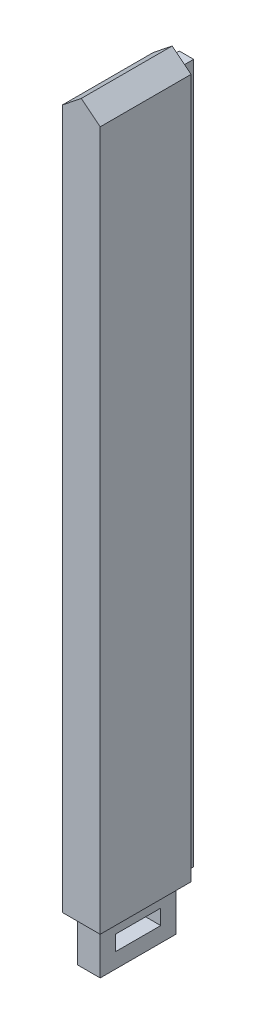
ISO-10303-21;
HEADER;
FILE_DESCRIPTION(('STEP AP214'),'2;1');
FILE_NAME('part.step','',(''),(''),'','','');
FILE_SCHEMA(('AUTOMOTIVE_DESIGN { 1 0 10303 214 1 1 1 1 }'));
ENDSEC;
DATA;
#1=APPLICATION_CONTEXT('core data for automotive mechanical design processes');
#2=APPLICATION_PROTOCOL_DEFINITION('international standard','automotive_design',2000,#1);
#3=PRODUCT_CONTEXT('',#1,'mechanical');
#4=PRODUCT('Part','Part','',(#3));
#5=PRODUCT_RELATED_PRODUCT_CATEGORY('part','',(#4));
#6=PRODUCT_DEFINITION_FORMATION('','',#4);
#7=PRODUCT_DEFINITION_CONTEXT('part definition',#1,'design');
#8=PRODUCT_DEFINITION('design','',#6,#7);
#9=PRODUCT_DEFINITION_SHAPE('','',#8);
#10=(LENGTH_UNIT() NAMED_UNIT(*) SI_UNIT(.MILLI.,.METRE.));
#11=(NAMED_UNIT(*) PLANE_ANGLE_UNIT() SI_UNIT($,.RADIAN.));
#12=(NAMED_UNIT(*) SI_UNIT($,.STERADIAN.) SOLID_ANGLE_UNIT());
#13=UNCERTAINTY_MEASURE_WITH_UNIT(LENGTH_MEASURE(1.E-05),#10,'distance_accuracy_value','');
#14=(GEOMETRIC_REPRESENTATION_CONTEXT(3) GLOBAL_UNCERTAINTY_ASSIGNED_CONTEXT((#13)) GLOBAL_UNIT_ASSIGNED_CONTEXT((#10,
#11,#12)) REPRESENTATION_CONTEXT('',''));
#15=CARTESIAN_POINT('',(0.,0.,0.));
#16=DIRECTION('',(0.,0.,1.));
#17=DIRECTION('',(1.,0.,0.));
#18=AXIS2_PLACEMENT_3D('',#15,#16,#17);
#19=CARTESIAN_POINT('',(1.,-98.4,0.));
#20=DIRECTION('',(1.,0.,0.));
#21=DIRECTION('',(0.,0.,-1.));
#22=AXIS2_PLACEMENT_3D('',#19,#20,#21);
#23=PLANE('',#22);
#24=DIRECTION('',(0.,0.,-1.));
#25=VECTOR('',#24,1.);
#26=CARTESIAN_POINT('',(1.,-92.4,0.));
#27=LINE('',#26,#25);
#28=CARTESIAN_POINT('',(1.,-92.4,11.));
#29=VERTEX_POINT('',#28);
#30=CARTESIAN_POINT('',(1.,-92.4,1.));
#31=VERTEX_POINT('',#30);
#32=EDGE_CURVE('E218',#29,#31,#27,.T.);
#33=ORIENTED_EDGE('',*,*,#32,.T.);
#34=DIRECTION('',(0.,1.,0.));
#35=VECTOR('',#34,1.);
#36=CARTESIAN_POINT('',(1.,-98.4,1.));
#37=LINE('',#36,#35);
#38=CARTESIAN_POINT('',(1.,-98.4,1.));
#39=VERTEX_POINT('',#38);
#40=EDGE_CURVE('E233',#39,#31,#37,.T.);
#41=ORIENTED_EDGE('',*,*,#40,.F.);
#42=DIRECTION('',(0.,0.,-1.));
#43=VECTOR('',#42,1.);
#44=CARTESIAN_POINT('',(1.,-98.4,0.));
#45=LINE('',#44,#43);
#46=CARTESIAN_POINT('',(1.,-98.4,11.));
#47=VERTEX_POINT('',#46);
#48=EDGE_CURVE('E203',#47,#39,#45,.T.);
#49=ORIENTED_EDGE('',*,*,#48,.F.);
#50=DIRECTION('',(0.,1.,0.));
#51=VECTOR('',#50,1.);
#52=CARTESIAN_POINT('',(1.,-98.4,11.));
#53=LINE('',#52,#51);
#54=EDGE_CURVE('E237',#47,#29,#53,.T.);
#55=ORIENTED_EDGE('',*,*,#54,.T.);
#56=EDGE_LOOP('',(#33,#41,#49,#55));
#57=FACE_BOUND('',#56,.T.);
#58=DIRECTION('',(0.,0.,-1.));
#59=VECTOR('',#58,1.);
#60=CARTESIAN_POINT('',(1.00000000000001,-96.4,0.));
#61=LINE('',#60,#59);
#62=CARTESIAN_POINT('',(1.,-96.4,9.));
#63=VERTEX_POINT('',#62);
#64=CARTESIAN_POINT('',(1.00000000000001,-96.4,3.));
#65=VERTEX_POINT('',#64);
#66=EDGE_CURVE('E61',#63,#65,#61,.T.);
#67=ORIENTED_EDGE('',*,*,#66,.T.);
#68=DIRECTION('',(0.,1.,0.));
#69=VECTOR('',#68,1.);
#70=CARTESIAN_POINT('',(1.00000000000001,0.,3.));
#71=LINE('',#70,#69);
#72=CARTESIAN_POINT('',(1.00000000000001,-94.4,3.));
#73=VERTEX_POINT('',#72);
#74=EDGE_CURVE('E174',#65,#73,#71,.T.);
#75=ORIENTED_EDGE('',*,*,#74,.T.);
#76=DIRECTION('',(0.,0.,-1.));
#77=VECTOR('',#76,1.);
#78=CARTESIAN_POINT('',(1.00000000000001,-94.4,0.));
#79=LINE('',#78,#77);
#80=CARTESIAN_POINT('',(1.00000000000001,-94.4,9.));
#81=VERTEX_POINT('',#80);
#82=EDGE_CURVE('E181',#81,#73,#79,.T.);
#83=ORIENTED_EDGE('',*,*,#82,.F.);
#84=DIRECTION('',(0.,1.,0.));
#85=VECTOR('',#84,1.);
#86=CARTESIAN_POINT('',(1.00000000000001,0.,9.));
#87=LINE('',#86,#85);
#88=EDGE_CURVE('E184',#63,#81,#87,.T.);
#89=ORIENTED_EDGE('',*,*,#88,.F.);
#90=EDGE_LOOP('',(#67,#75,#83,#89));
#91=FACE_BOUND('',#90,.T.);
#92=ADVANCED_FACE('F45',(#57,#91),#23,.F.);
#93=CARTESIAN_POINT('',(4.00000000000001,-98.4,0.));
#94=DIRECTION('',(1.,0.,0.));
#95=DIRECTION('',(0.,0.,-1.));
#96=AXIS2_PLACEMENT_3D('',#93,#94,#95);
#97=PLANE('',#96);
#98=DIRECTION('',(0.,0.,-1.));
#99=VECTOR('',#98,1.);
#100=CARTESIAN_POINT('',(4.00000000000001,-92.4,0.));
#101=LINE('',#100,#99);
#102=CARTESIAN_POINT('',(4.00000000000001,-92.4,11.));
#103=VERTEX_POINT('',#102);
#104=CARTESIAN_POINT('',(4.00000000000001,-92.4,0.999999999999999));
#105=VERTEX_POINT('',#104);
#106=EDGE_CURVE('E204',#103,#105,#101,.T.);
#107=ORIENTED_EDGE('',*,*,#106,.F.);
#108=DIRECTION('',(0.,1.,0.));
#109=VECTOR('',#108,1.);
#110=CARTESIAN_POINT('',(4.00000000000001,-98.4,11.));
#111=LINE('',#110,#109);
#112=CARTESIAN_POINT('',(4.00000000000001,-98.4,11.));
#113=VERTEX_POINT('',#112);
#114=EDGE_CURVE('E214',#113,#103,#111,.T.);
#115=ORIENTED_EDGE('',*,*,#114,.F.);
#116=DIRECTION('',(0.,0.,-1.));
#117=VECTOR('',#116,1.);
#118=CARTESIAN_POINT('',(4.00000000000001,-98.4,0.));
#119=LINE('',#118,#117);
#120=CARTESIAN_POINT('',(4.00000000000001,-98.4,1.));
#121=VERTEX_POINT('',#120);
#122=EDGE_CURVE('E210',#113,#121,#119,.T.);
#123=ORIENTED_EDGE('',*,*,#122,.T.);
#124=DIRECTION('',(0.,1.,0.));
#125=VECTOR('',#124,1.);
#126=CARTESIAN_POINT('',(4.00000000000001,-98.4,1.));
#127=LINE('',#126,#125);
#128=EDGE_CURVE('E229',#121,#105,#127,.T.);
#129=ORIENTED_EDGE('',*,*,#128,.T.);
#130=EDGE_LOOP('',(#107,#115,#123,#129));
#131=FACE_BOUND('',#130,.T.);
#132=DIRECTION('',(0.,-1.,0.));
#133=VECTOR('',#132,1.);
#134=CARTESIAN_POINT('',(4.00000000000001,-98.4,3.));
#135=LINE('',#134,#133);
#136=CARTESIAN_POINT('',(4.00000000000001,-94.4,3.));
#137=VERTEX_POINT('',#136);
#138=CARTESIAN_POINT('',(4.00000000000001,-96.4,3.));
#139=VERTEX_POINT('',#138);
#140=EDGE_CURVE('E54',#137,#139,#135,.T.);
#141=ORIENTED_EDGE('',*,*,#140,.T.);
#142=DIRECTION('',(0.,0.,1.));
#143=VECTOR('',#142,1.);
#144=CARTESIAN_POINT('',(4.00000000000001,-96.4,0.));
#145=LINE('',#144,#143);
#146=CARTESIAN_POINT('',(4.00000000000001,-96.4,9.));
#147=VERTEX_POINT('',#146);
#148=EDGE_CURVE('E11',#139,#147,#145,.T.);
#149=ORIENTED_EDGE('',*,*,#148,.T.);
#150=DIRECTION('',(0.,-1.,0.));
#151=VECTOR('',#150,1.);
#152=CARTESIAN_POINT('',(4.00000000000001,-98.4,9.));
#153=LINE('',#152,#151);
#154=CARTESIAN_POINT('',(4.00000000000001,-94.4,9.));
#155=VERTEX_POINT('',#154);
#156=EDGE_CURVE('E334',#155,#147,#153,.T.);
#157=ORIENTED_EDGE('',*,*,#156,.F.);
#158=DIRECTION('',(0.,0.,1.));
#159=VECTOR('',#158,1.);
#160=CARTESIAN_POINT('',(4.00000000000001,-94.4,0.));
#161=LINE('',#160,#159);
#162=EDGE_CURVE('E337',#137,#155,#161,.T.);
#163=ORIENTED_EDGE('',*,*,#162,.F.);
#164=EDGE_LOOP('',(#141,#149,#157,#163));
#165=FACE_BOUND('',#164,.T.);
#166=ADVANCED_FACE('F342',(#131,#165),#97,.T.);
#167=CARTESIAN_POINT('',(1.9482421875,2.43835258245095,12.));
#168=DIRECTION('',(-0.624218261107443,-0.78125,0.));
#169=DIRECTION('',(0.78125,-0.624218261107443,0.));
#170=AXIS2_PLACEMENT_3D('',#167,#168,#169);
#171=PLANE('',#170);
#172=DIRECTION('',(-0.78125,0.624218261107443,0.));
#173=VECTOR('',#172,1.);
#174=CARTESIAN_POINT('',(1.9482421875,2.43835258245095,0.));
#175=LINE('',#174,#173);
#176=CARTESIAN_POINT('',(5.,0.,0.));
#177=VERTEX_POINT('',#176);
#178=CARTESIAN_POINT('',(2.5,1.99749843554382,0.));
#179=VERTEX_POINT('',#178);
#180=EDGE_CURVE('E279',#177,#179,#175,.T.);
#181=ORIENTED_EDGE('',*,*,#180,.T.);
#182=DIRECTION('',(0.,0.,-1.));
#183=VECTOR('',#182,1.);
#184=CARTESIAN_POINT('',(2.5,1.99749843554382,12.));
#185=LINE('',#184,#183);
#186=CARTESIAN_POINT('',(2.5,1.99749843554382,12.));
#187=VERTEX_POINT('',#186);
#188=EDGE_CURVE('E330',#187,#179,#185,.T.);
#189=ORIENTED_EDGE('',*,*,#188,.F.);
#190=DIRECTION('',(-0.78125,0.624218261107443,0.));
#191=VECTOR('',#190,1.);
#192=CARTESIAN_POINT('',(1.9482421875,2.43835258245095,12.));
#193=LINE('',#192,#191);
#194=CARTESIAN_POINT('',(5.,0.,12.));
#195=VERTEX_POINT('',#194);
#196=EDGE_CURVE('E280',#195,#187,#193,.T.);
#197=ORIENTED_EDGE('',*,*,#196,.F.);
#198=DIRECTION('',(0.,0.,-1.));
#199=VECTOR('',#198,1.);
#200=CARTESIAN_POINT('',(5.,0.,12.));
#201=LINE('',#200,#199);
#202=EDGE_CURVE('E298',#195,#177,#201,.T.);
#203=ORIENTED_EDGE('',*,*,#202,.T.);
#204=EDGE_LOOP('',(#181,#189,#197,#203));
#205=FACE_BOUND('',#204,.T.);
#206=ADVANCED_FACE('F47',(#205),#171,.F.);
#207=CARTESIAN_POINT('',(0.,0.,12.));
#208=DIRECTION('',(0.624218261107443,-0.78125,0.));
#209=DIRECTION('',(0.78125,0.624218261107443,0.));
#210=AXIS2_PLACEMENT_3D('',#207,#208,#209);
#211=PLANE('',#210);
#212=DIRECTION('',(-0.78125,-0.624218261107443,0.));
#213=VECTOR('',#212,1.);
#214=CARTESIAN_POINT('',(0.,0.,0.));
#215=LINE('',#214,#213);
#216=CARTESIAN_POINT('',(0.,0.,0.));
#217=VERTEX_POINT('',#216);
#218=EDGE_CURVE('E302',#179,#217,#215,.T.);
#219=ORIENTED_EDGE('',*,*,#218,.T.);
#220=DIRECTION('',(0.,0.,-1.));
#221=VECTOR('',#220,1.);
#222=CARTESIAN_POINT('',(0.,0.,12.));
#223=LINE('',#222,#221);
#224=CARTESIAN_POINT('',(0.,0.,12.));
#225=VERTEX_POINT('',#224);
#226=EDGE_CURVE('E326',#225,#217,#223,.T.);
#227=ORIENTED_EDGE('',*,*,#226,.F.);
#228=DIRECTION('',(-0.78125,-0.624218261107443,0.));
#229=VECTOR('',#228,1.);
#230=CARTESIAN_POINT('',(0.,0.,12.));
#231=LINE('',#230,#229);
#232=EDGE_CURVE('E284',#187,#225,#231,.T.);
#233=ORIENTED_EDGE('',*,*,#232,.F.);
#234=ORIENTED_EDGE('',*,*,#188,.T.);
#235=EDGE_LOOP('',(#219,#227,#233,#234));
#236=FACE_BOUND('',#235,.T.);
#237=ADVANCED_FACE('F403',(#236),#211,.F.);
#238=CARTESIAN_POINT('',(0.,0.,12.));
#239=DIRECTION('',(1.,0.,0.));
#240=DIRECTION('',(0.,1.,0.));
#241=AXIS2_PLACEMENT_3D('',#238,#239,#240);
#242=PLANE('',#241);
#243=DIRECTION('',(0.,-1.,0.));
#244=VECTOR('',#243,1.);
#245=CARTESIAN_POINT('',(0.,0.,0.));
#246=LINE('',#245,#244);
#247=CARTESIAN_POINT('',(0.,-92.4,0.));
#248=VERTEX_POINT('',#247);
#249=EDGE_CURVE('E305',#217,#248,#246,.T.);
#250=ORIENTED_EDGE('',*,*,#249,.T.);
#251=DIRECTION('',(0.,0.,-1.));
#252=VECTOR('',#251,1.);
#253=CARTESIAN_POINT('',(0.,-92.4,12.));
#254=LINE('',#253,#252);
#255=CARTESIAN_POINT('',(0.,-92.4,12.));
#256=VERTEX_POINT('',#255);
#257=EDGE_CURVE('E322',#256,#248,#254,.T.);
#258=ORIENTED_EDGE('',*,*,#257,.F.);
#259=DIRECTION('',(0.,-1.,0.));
#260=VECTOR('',#259,1.);
#261=CARTESIAN_POINT('',(0.,0.,12.));
#262=LINE('',#261,#260);
#263=EDGE_CURVE('E288',#225,#256,#262,.T.);
#264=ORIENTED_EDGE('',*,*,#263,.F.);
#265=ORIENTED_EDGE('',*,*,#226,.T.);
#266=EDGE_LOOP('',(#250,#258,#264,#265));
#267=FACE_BOUND('',#266,.T.);
#268=ADVANCED_FACE('F400',(#267),#242,.F.);
#269=CARTESIAN_POINT('',(0.,-92.4,12.));
#270=DIRECTION('',(0.,1.,0.));
#271=DIRECTION('',(0.,0.,1.));
#272=AXIS2_PLACEMENT_3D('',#269,#270,#271);
#273=PLANE('',#272);
#274=ORIENTED_EDGE('',*,*,#32,.F.);
#275=DIRECTION('',(1.,0.,0.));
#276=VECTOR('',#275,1.);
#277=CARTESIAN_POINT('',(0.,-92.4,11.));
#278=LINE('',#277,#276);
#279=EDGE_CURVE('E170',#29,#103,#278,.T.);
#280=ORIENTED_EDGE('',*,*,#279,.T.);
#281=ORIENTED_EDGE('',*,*,#106,.T.);
#282=DIRECTION('',(1.,0.,0.));
#283=VECTOR('',#282,1.);
#284=CARTESIAN_POINT('',(0.,-92.4,1.));
#285=LINE('',#284,#283);
#286=EDGE_CURVE('E221',#31,#105,#285,.T.);
#287=ORIENTED_EDGE('',*,*,#286,.F.);
#288=EDGE_LOOP('',(#274,#280,#281,#287));
#289=FACE_BOUND('',#288,.T.);
#290=DIRECTION('',(1.,0.,0.));
#291=VECTOR('',#290,1.);
#292=CARTESIAN_POINT('',(0.,-92.4,0.));
#293=LINE('',#292,#291);
#294=CARTESIAN_POINT('',(1.54999999999999,-92.4,0.));
#295=VERTEX_POINT('',#294);
#296=EDGE_CURVE('E309',#248,#295,#293,.T.);
#297=ORIENTED_EDGE('',*,*,#296,.T.);
#298=DIRECTION('',(0.,0.,1.));
#299=VECTOR('',#298,1.);
#300=CARTESIAN_POINT('',(1.54999999999999,-92.4,-1.9));
#301=LINE('',#300,#299);
#302=CARTESIAN_POINT('',(1.54999999999999,-92.4,-1.9));
#303=VERTEX_POINT('',#302);
#304=EDGE_CURVE('E256',#303,#295,#301,.T.);
#305=ORIENTED_EDGE('',*,*,#304,.F.);
#306=DIRECTION('',(-1.,0.,0.));
#307=VECTOR('',#306,1.);
#308=CARTESIAN_POINT('',(0.,-92.4,-1.9));
#309=LINE('',#308,#307);
#310=CARTESIAN_POINT('',(3.45,-92.4,-1.9));
#311=VERTEX_POINT('',#310);
#312=EDGE_CURVE('E253',#311,#303,#309,.T.);
#313=ORIENTED_EDGE('',*,*,#312,.F.);
#314=DIRECTION('',(0.,0.,1.));
#315=VECTOR('',#314,1.);
#316=CARTESIAN_POINT('',(3.45,-92.4,-1.9));
#317=LINE('',#316,#315);
#318=CARTESIAN_POINT('',(3.45,-92.4,0.));
#319=VERTEX_POINT('',#318);
#320=EDGE_CURVE('E268',#311,#319,#317,.T.);
#321=ORIENTED_EDGE('',*,*,#320,.T.);
#322=CARTESIAN_POINT('',(5.00000000000001,-92.4,0.));
#323=VERTEX_POINT('',#322);
#324=EDGE_CURVE('E308',#319,#323,#293,.T.);
#325=ORIENTED_EDGE('',*,*,#324,.T.);
#326=DIRECTION('',(0.,0.,-1.));
#327=VECTOR('',#326,1.);
#328=CARTESIAN_POINT('',(5.00000000000001,-92.4,12.));
#329=LINE('',#328,#327);
#330=CARTESIAN_POINT('',(5.00000000000001,-92.4,12.));
#331=VERTEX_POINT('',#330);
#332=EDGE_CURVE('E318',#331,#323,#329,.T.);
#333=ORIENTED_EDGE('',*,*,#332,.F.);
#334=DIRECTION('',(1.,0.,0.));
#335=VECTOR('',#334,1.);
#336=CARTESIAN_POINT('',(0.,-92.4,12.));
#337=LINE('',#336,#335);
#338=EDGE_CURVE('E291',#256,#331,#337,.T.);
#339=ORIENTED_EDGE('',*,*,#338,.F.);
#340=ORIENTED_EDGE('',*,*,#257,.T.);
#341=EDGE_LOOP('',(#297,#305,#313,#321,#325,#333,#339,#340));
#342=FACE_BOUND('',#341,.T.);
#343=ADVANCED_FACE('F396',(#289,#342),#273,.F.);
#344=CARTESIAN_POINT('',(5.,0.,12.));
#345=DIRECTION('',(1.,0.,0.));
#346=DIRECTION('',(0.,1.,0.));
#347=AXIS2_PLACEMENT_3D('',#344,#345,#346);
#348=PLANE('',#347);
#349=DIRECTION('',(0.,-1.,0.));
#350=VECTOR('',#349,1.);
#351=CARTESIAN_POINT('',(5.,0.,0.));
#352=LINE('',#351,#350);
#353=EDGE_CURVE('E285',#177,#323,#352,.T.);
#354=ORIENTED_EDGE('',*,*,#353,.F.);
#355=ORIENTED_EDGE('',*,*,#202,.F.);
#356=DIRECTION('',(0.,-1.,0.));
#357=VECTOR('',#356,1.);
#358=CARTESIAN_POINT('',(5.,0.,12.));
#359=LINE('',#358,#357);
#360=EDGE_CURVE('E294',#195,#331,#359,.T.);
#361=ORIENTED_EDGE('',*,*,#360,.T.);
#362=ORIENTED_EDGE('',*,*,#332,.T.);
#363=EDGE_LOOP('',(#354,#355,#361,#362));
#364=FACE_BOUND('',#363,.T.);
#365=ADVANCED_FACE('F389',(#364),#348,.T.);
#366=CARTESIAN_POINT('',(0.,0.,12.));
#367=DIRECTION('',(0.,0.,1.));
#368=DIRECTION('',(1.,0.,0.));
#369=AXIS2_PLACEMENT_3D('',#366,#367,#368);
#370=PLANE('',#369);
#371=ORIENTED_EDGE('',*,*,#196,.T.);
#372=ORIENTED_EDGE('',*,*,#232,.T.);
#373=ORIENTED_EDGE('',*,*,#263,.T.);
#374=ORIENTED_EDGE('',*,*,#338,.T.);
#375=ORIENTED_EDGE('',*,*,#360,.F.);
#376=EDGE_LOOP('',(#371,#372,#373,#374,#375));
#377=FACE_BOUND('',#376,.T.);
#378=ADVANCED_FACE('F386',(#377),#370,.T.);
#379=CARTESIAN_POINT('',(0.,0.,0.));
#380=DIRECTION('',(0.,0.,1.));
#381=DIRECTION('',(1.,0.,0.));
#382=AXIS2_PLACEMENT_3D('',#379,#380,#381);
#383=PLANE('',#382);
#384=DIRECTION('',(-1.,0.,0.));
#385=VECTOR('',#384,1.);
#386=CARTESIAN_POINT('',(0.,0.,0.));
#387=LINE('',#386,#385);
#388=CARTESIAN_POINT('',(3.45,0.,0.));
#389=VERTEX_POINT('',#388);
#390=CARTESIAN_POINT('',(1.55,0.,0.));
#391=VERTEX_POINT('',#390);
#392=EDGE_CURVE('E260',#389,#391,#387,.T.);
#393=ORIENTED_EDGE('',*,*,#392,.T.);
#394=DIRECTION('',(0.,-1.,0.));
#395=VECTOR('',#394,1.);
#396=CARTESIAN_POINT('',(1.55,0.,0.));
#397=LINE('',#396,#395);
#398=EDGE_CURVE('E240',#391,#295,#397,.T.);
#399=ORIENTED_EDGE('',*,*,#398,.T.);
#400=ORIENTED_EDGE('',*,*,#296,.F.);
#401=ORIENTED_EDGE('',*,*,#249,.F.);
#402=ORIENTED_EDGE('',*,*,#218,.F.);
#403=ORIENTED_EDGE('',*,*,#180,.F.);
#404=ORIENTED_EDGE('',*,*,#353,.T.);
#405=ORIENTED_EDGE('',*,*,#324,.F.);
#406=DIRECTION('',(0.,-1.,0.));
#407=VECTOR('',#406,1.);
#408=CARTESIAN_POINT('',(3.45,0.,0.));
#409=LINE('',#408,#407);
#410=EDGE_CURVE('E246',#389,#319,#409,.T.);
#411=ORIENTED_EDGE('',*,*,#410,.F.);
#412=EDGE_LOOP('',(#393,#399,#400,#401,#402,#403,#404,#405,#411));
#413=FACE_BOUND('',#412,.T.);
#414=ADVANCED_FACE('F384',(#413),#383,.F.);
#415=CARTESIAN_POINT('',(1.55,0.,-1.9));
#416=DIRECTION('',(-1.,0.,0.));
#417=DIRECTION('',(0.,-1.,0.));
#418=AXIS2_PLACEMENT_3D('',#415,#416,#417);
#419=PLANE('',#418);
#420=ORIENTED_EDGE('',*,*,#398,.F.);
#421=DIRECTION('',(0.,0.,1.));
#422=VECTOR('',#421,1.);
#423=CARTESIAN_POINT('',(1.55,0.,-1.9));
#424=LINE('',#423,#422);
#425=CARTESIAN_POINT('',(1.55,0.,-1.9));
#426=VERTEX_POINT('',#425);
#427=EDGE_CURVE('E275',#426,#391,#424,.T.);
#428=ORIENTED_EDGE('',*,*,#427,.F.);
#429=DIRECTION('',(0.,-1.,0.));
#430=VECTOR('',#429,1.);
#431=CARTESIAN_POINT('',(1.55,0.,-1.9));
#432=LINE('',#431,#430);
#433=EDGE_CURVE('E241',#426,#303,#432,.T.);
#434=ORIENTED_EDGE('',*,*,#433,.T.);
#435=ORIENTED_EDGE('',*,*,#304,.T.);
#436=EDGE_LOOP('',(#420,#428,#434,#435));
#437=FACE_BOUND('',#436,.T.);
#438=ADVANCED_FACE('F380',(#437),#419,.T.);
#439=CARTESIAN_POINT('',(0.,0.,-1.9));
#440=DIRECTION('',(0.,1.,0.));
#441=DIRECTION('',(0.,0.,1.));
#442=AXIS2_PLACEMENT_3D('',#439,#440,#441);
#443=PLANE('',#442);
#444=ORIENTED_EDGE('',*,*,#392,.F.);
#445=DIRECTION('',(0.,0.,1.));
#446=VECTOR('',#445,1.);
#447=CARTESIAN_POINT('',(3.45,0.,-1.9));
#448=LINE('',#447,#446);
#449=CARTESIAN_POINT('',(3.45,0.,-1.9));
#450=VERTEX_POINT('',#449);
#451=EDGE_CURVE('E272',#450,#389,#448,.T.);
#452=ORIENTED_EDGE('',*,*,#451,.F.);
#453=DIRECTION('',(-1.,0.,0.));
#454=VECTOR('',#453,1.);
#455=CARTESIAN_POINT('',(0.,0.,-1.9));
#456=LINE('',#455,#454);
#457=EDGE_CURVE('E245',#450,#426,#456,.T.);
#458=ORIENTED_EDGE('',*,*,#457,.T.);
#459=ORIENTED_EDGE('',*,*,#427,.T.);
#460=EDGE_LOOP('',(#444,#452,#458,#459));
#461=FACE_BOUND('',#460,.T.);
#462=ADVANCED_FACE('F376',(#461),#443,.T.);
#463=CARTESIAN_POINT('',(3.45,0.,-1.9));
#464=DIRECTION('',(-1.,0.,0.));
#465=DIRECTION('',(0.,0.,1.));
#466=AXIS2_PLACEMENT_3D('',#463,#464,#465);
#467=PLANE('',#466);
#468=ORIENTED_EDGE('',*,*,#410,.T.);
#469=ORIENTED_EDGE('',*,*,#320,.F.);
#470=DIRECTION('',(0.,-1.,0.));
#471=VECTOR('',#470,1.);
#472=CARTESIAN_POINT('',(3.45,0.,-1.9));
#473=LINE('',#472,#471);
#474=EDGE_CURVE('E250',#450,#311,#473,.T.);
#475=ORIENTED_EDGE('',*,*,#474,.F.);
#476=ORIENTED_EDGE('',*,*,#451,.T.);
#477=EDGE_LOOP('',(#468,#469,#475,#476));
#478=FACE_BOUND('',#477,.T.);
#479=ADVANCED_FACE('F372',(#478),#467,.F.);
#480=CARTESIAN_POINT('',(0.,0.,-1.9));
#481=DIRECTION('',(0.,0.,-1.));
#482=DIRECTION('',(-1.,0.,0.));
#483=AXIS2_PLACEMENT_3D('',#480,#481,#482);
#484=PLANE('',#483);
#485=ORIENTED_EDGE('',*,*,#433,.F.);
#486=ORIENTED_EDGE('',*,*,#457,.F.);
#487=ORIENTED_EDGE('',*,*,#474,.T.);
#488=ORIENTED_EDGE('',*,*,#312,.T.);
#489=EDGE_LOOP('',(#485,#486,#487,#488));
#490=FACE_BOUND('',#489,.T.);
#491=ADVANCED_FACE('F368',(#490),#484,.T.);
#492=CARTESIAN_POINT('',(0.,-98.4,11.));
#493=DIRECTION('',(0.,0.,1.));
#494=DIRECTION('',(1.,0.,0.));
#495=AXIS2_PLACEMENT_3D('',#492,#493,#494);
#496=PLANE('',#495);
#497=ORIENTED_EDGE('',*,*,#279,.F.);
#498=ORIENTED_EDGE('',*,*,#54,.F.);
#499=DIRECTION('',(1.,0.,0.));
#500=VECTOR('',#499,1.);
#501=CARTESIAN_POINT('',(0.,-98.4,11.));
#502=LINE('',#501,#500);
#503=EDGE_CURVE('E199',#47,#113,#502,.T.);
#504=ORIENTED_EDGE('',*,*,#503,.T.);
#505=ORIENTED_EDGE('',*,*,#114,.T.);
#506=EDGE_LOOP('',(#497,#498,#504,#505));
#507=FACE_BOUND('',#506,.T.);
#508=ADVANCED_FACE('F365',(#507),#496,.T.);
#509=CARTESIAN_POINT('',(0.,-98.4,1.));
#510=DIRECTION('',(0.,0.,1.));
#511=DIRECTION('',(1.,0.,0.));
#512=AXIS2_PLACEMENT_3D('',#509,#510,#511);
#513=PLANE('',#512);
#514=ORIENTED_EDGE('',*,*,#286,.T.);
#515=ORIENTED_EDGE('',*,*,#128,.F.);
#516=DIRECTION('',(1.,0.,0.));
#517=VECTOR('',#516,1.);
#518=CARTESIAN_POINT('',(0.,-98.4,1.));
#519=LINE('',#518,#517);
#520=EDGE_CURVE('E207',#39,#121,#519,.T.);
#521=ORIENTED_EDGE('',*,*,#520,.F.);
#522=ORIENTED_EDGE('',*,*,#40,.T.);
#523=EDGE_LOOP('',(#514,#515,#521,#522));
#524=FACE_BOUND('',#523,.T.);
#525=ADVANCED_FACE('F364',(#524),#513,.F.);
#526=CARTESIAN_POINT('',(0.,-98.4,0.));
#527=DIRECTION('',(0.,-1.,0.));
#528=DIRECTION('',(0.,0.,-1.));
#529=AXIS2_PLACEMENT_3D('',#526,#527,#528);
#530=PLANE('',#529);
#531=ORIENTED_EDGE('',*,*,#503,.F.);
#532=ORIENTED_EDGE('',*,*,#48,.T.);
#533=ORIENTED_EDGE('',*,*,#520,.T.);
#534=ORIENTED_EDGE('',*,*,#122,.F.);
#535=EDGE_LOOP('',(#531,#532,#533,#534));
#536=FACE_BOUND('',#535,.T.);
#537=ADVANCED_FACE('F521',(#536),#530,.T.);
#538=CARTESIAN_POINT('',(5.00000000000001,-96.4,0.));
#539=DIRECTION('',(0.,1.,0.));
#540=DIRECTION('',(0.,0.,1.));
#541=AXIS2_PLACEMENT_3D('',#538,#539,#540);
#542=PLANE('',#541);
#543=DIRECTION('',(-1.,0.,0.));
#544=VECTOR('',#543,1.);
#545=CARTESIAN_POINT('',(5.00000000000001,-96.4,3.));
#546=LINE('',#545,#544);
#547=EDGE_CURVE('E164',#139,#65,#546,.T.);
#548=ORIENTED_EDGE('',*,*,#547,.T.);
#549=ORIENTED_EDGE('',*,*,#66,.F.);
#550=DIRECTION('',(-1.,0.,0.));
#551=VECTOR('',#550,1.);
#552=CARTESIAN_POINT('',(5.00000000000001,-96.4,9.));
#553=LINE('',#552,#551);
#554=EDGE_CURVE('E192',#147,#63,#553,.T.);
#555=ORIENTED_EDGE('',*,*,#554,.F.);
#556=ORIENTED_EDGE('',*,*,#148,.F.);
#557=EDGE_LOOP('',(#548,#549,#555,#556));
#558=FACE_BOUND('',#557,.T.);
#559=ADVANCED_FACE('F166',(#558),#542,.T.);
#560=CARTESIAN_POINT('',(5.00000000000001,0.,3.));
#561=DIRECTION('',(0.,0.,1.));
#562=DIRECTION('',(1.,0.,0.));
#563=AXIS2_PLACEMENT_3D('',#560,#561,#562);
#564=PLANE('',#563);
#565=DIRECTION('',(-1.,0.,0.));
#566=VECTOR('',#565,1.);
#567=CARTESIAN_POINT('',(5.00000000000001,-94.4,3.));
#568=LINE('',#567,#566);
#569=EDGE_CURVE('E171',#137,#73,#568,.T.);
#570=ORIENTED_EDGE('',*,*,#569,.T.);
#571=ORIENTED_EDGE('',*,*,#74,.F.);
#572=ORIENTED_EDGE('',*,*,#547,.F.);
#573=ORIENTED_EDGE('',*,*,#140,.F.);
#574=EDGE_LOOP('',(#570,#571,#572,#573));
#575=FACE_BOUND('',#574,.T.);
#576=ADVANCED_FACE('F175',(#575),#564,.T.);
#577=CARTESIAN_POINT('',(5.00000000000001,-94.4,0.));
#578=DIRECTION('',(0.,1.,0.));
#579=DIRECTION('',(0.,0.,1.));
#580=AXIS2_PLACEMENT_3D('',#577,#578,#579);
#581=PLANE('',#580);
#582=ORIENTED_EDGE('',*,*,#162,.T.);
#583=DIRECTION('',(-1.,0.,0.));
#584=VECTOR('',#583,1.);
#585=CARTESIAN_POINT('',(5.00000000000001,-94.4,9.));
#586=LINE('',#585,#584);
#587=EDGE_CURVE('E69',#155,#81,#586,.T.);
#588=ORIENTED_EDGE('',*,*,#587,.T.);
#589=ORIENTED_EDGE('',*,*,#82,.T.);
#590=ORIENTED_EDGE('',*,*,#569,.F.);
#591=EDGE_LOOP('',(#582,#588,#589,#590));
#592=FACE_BOUND('',#591,.T.);
#593=ADVANCED_FACE('F345',(#592),#581,.F.);
#594=CARTESIAN_POINT('',(5.00000000000001,0.,9.));
#595=DIRECTION('',(0.,0.,1.));
#596=DIRECTION('',(1.,0.,0.));
#597=AXIS2_PLACEMENT_3D('',#594,#595,#596);
#598=PLANE('',#597);
#599=ORIENTED_EDGE('',*,*,#156,.T.);
#600=ORIENTED_EDGE('',*,*,#554,.T.);
#601=ORIENTED_EDGE('',*,*,#88,.T.);
#602=ORIENTED_EDGE('',*,*,#587,.F.);
#603=EDGE_LOOP('',(#599,#600,#601,#602));
#604=FACE_BOUND('',#603,.T.);
#605=ADVANCED_FACE('F346',(#604),#598,.F.);
#606=CLOSED_SHELL('',(#92,#166,#206,#237,#268,#343,#365,#378,#414,#438,#462,#479,#491,#508,#525,
#537,#559,#576,#593,#605));
#607=MANIFOLD_SOLID_BREP('B2',#606);
#608=ADVANCED_BREP_SHAPE_REPRESENTATION('',(#18,#607),#14);
#609=SHAPE_DEFINITION_REPRESENTATION(#9,#608);
ENDSEC;
END-ISO-10303-21;
